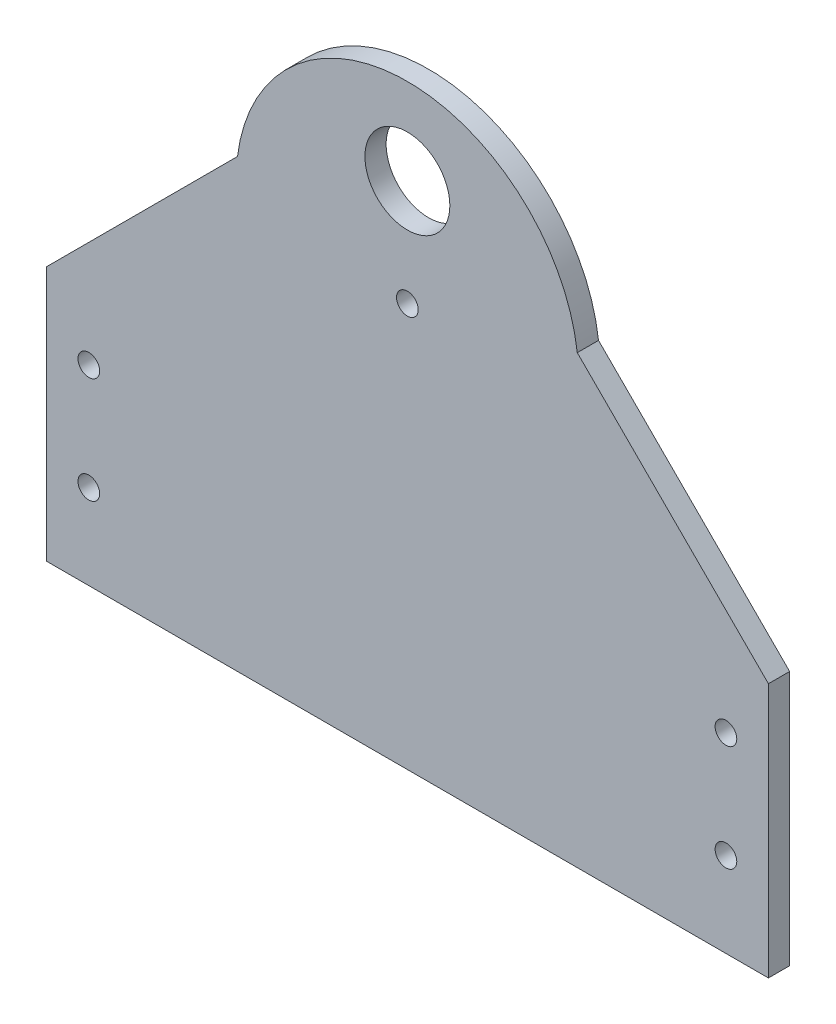
ISO-10303-21;
HEADER;
FILE_DESCRIPTION(('STEP AP214'),'2;1');
FILE_NAME('part.step','',(''),(''),'','','');
FILE_SCHEMA(('AUTOMOTIVE_DESIGN { 1 0 10303 214 1 1 1 1 }'));
ENDSEC;
DATA;
#1=APPLICATION_CONTEXT('core data for automotive mechanical design processes');
#2=APPLICATION_PROTOCOL_DEFINITION('international standard','automotive_design',2000,#1);
#3=PRODUCT_CONTEXT('',#1,'mechanical');
#4=PRODUCT('Part','Part','',(#3));
#5=PRODUCT_RELATED_PRODUCT_CATEGORY('part','',(#4));
#6=PRODUCT_DEFINITION_FORMATION('','',#4);
#7=PRODUCT_DEFINITION_CONTEXT('part definition',#1,'design');
#8=PRODUCT_DEFINITION('design','',#6,#7);
#9=PRODUCT_DEFINITION_SHAPE('','',#8);
#10=(LENGTH_UNIT() NAMED_UNIT(*) SI_UNIT(.MILLI.,.METRE.));
#11=(NAMED_UNIT(*) PLANE_ANGLE_UNIT() SI_UNIT($,.RADIAN.));
#12=(NAMED_UNIT(*) SI_UNIT($,.STERADIAN.) SOLID_ANGLE_UNIT());
#13=UNCERTAINTY_MEASURE_WITH_UNIT(LENGTH_MEASURE(1.E-05),#10,'distance_accuracy_value','');
#14=(GEOMETRIC_REPRESENTATION_CONTEXT(3) GLOBAL_UNCERTAINTY_ASSIGNED_CONTEXT((#13)) GLOBAL_UNIT_ASSIGNED_CONTEXT((#10,
#11,#12)) REPRESENTATION_CONTEXT('',''));
#15=CARTESIAN_POINT('',(0.,0.,0.));
#16=DIRECTION('',(0.,0.,1.));
#17=DIRECTION('',(1.,0.,0.));
#18=AXIS2_PLACEMENT_3D('',#15,#16,#17);
#19=CARTESIAN_POINT('',(0.,28.5999999999999,5.));
#20=DIRECTION('',(0.,0.,-1.));
#21=DIRECTION('',(-1.,0.,0.));
#22=AXIS2_PLACEMENT_3D('',#19,#20,#21);
#23=PLANE('',#22);
#24=DIRECTION('',(1.,0.,0.));
#25=VECTOR('',#24,1.);
#26=CARTESIAN_POINT('',(85.,-71.3999999999999,5.));
#27=LINE('',#26,#25);
#28=CARTESIAN_POINT('',(-85.,-71.3999999999999,5.));
#29=VERTEX_POINT('',#28);
#30=CARTESIAN_POINT('',(85.,-71.3999999999999,5.));
#31=VERTEX_POINT('',#30);
#32=EDGE_CURVE('E146',#29,#31,#27,.T.);
#33=ORIENTED_EDGE('',*,*,#32,.T.);
#34=DIRECTION('',(0.,1.,0.));
#35=VECTOR('',#34,1.);
#36=CARTESIAN_POINT('',(85.,-11.3999999999999,5.));
#37=LINE('',#36,#35);
#38=CARTESIAN_POINT('',(85.,-11.3999999999999,5.));
#39=VERTEX_POINT('',#38);
#40=EDGE_CURVE('E94',#31,#39,#37,.T.);
#41=ORIENTED_EDGE('',*,*,#40,.T.);
#42=DIRECTION('',(-0.707106781186549,0.707106781186546,0.));
#43=VECTOR('',#42,1.);
#44=CARTESIAN_POINT('',(40.,33.6,5.));
#45=LINE('',#44,#43);
#46=CARTESIAN_POINT('',(40.,33.6,5.));
#47=VERTEX_POINT('',#46);
#48=EDGE_CURVE('E107',#39,#47,#45,.T.);
#49=ORIENTED_EDGE('',*,*,#48,.T.);
#50=CARTESIAN_POINT('',(0.,28.5999999999999,5.));
#51=DIRECTION('',(0.,0.,1.));
#52=DIRECTION('',(-1.,0.,0.));
#53=AXIS2_PLACEMENT_3D('',#50,#51,#52);
#54=CIRCLE('',#53,40.3112887414928);
#55=CARTESIAN_POINT('',(-40.,33.6,5.));
#56=VERTEX_POINT('',#55);
#57=EDGE_CURVE('E101',#47,#56,#54,.T.);
#58=ORIENTED_EDGE('',*,*,#57,.T.);
#59=DIRECTION('',(-0.707106781186549,-0.707106781186546,0.));
#60=VECTOR('',#59,1.);
#61=CARTESIAN_POINT('',(-85.,-11.3999999999999,5.));
#62=LINE('',#61,#60);
#63=CARTESIAN_POINT('',(-85.,-11.3999999999999,5.));
#64=VERTEX_POINT('',#63);
#65=EDGE_CURVE('E105',#56,#64,#62,.T.);
#66=ORIENTED_EDGE('',*,*,#65,.T.);
#67=DIRECTION('',(0.,-1.,0.));
#68=VECTOR('',#67,1.);
#69=CARTESIAN_POINT('',(-85.,-71.3999999999999,5.));
#70=LINE('',#69,#68);
#71=EDGE_CURVE('E57',#64,#29,#70,.T.);
#72=ORIENTED_EDGE('',*,*,#71,.T.);
#73=EDGE_LOOP('',(#33,#41,#49,#58,#66,#72));
#74=FACE_BOUND('',#73,.T.);
#75=CARTESIAN_POINT('',(75.,-26.3999999999999,5.));
#76=DIRECTION('',(0.,0.,1.));
#77=DIRECTION('',(1.,0.,0.));
#78=AXIS2_PLACEMENT_3D('',#75,#76,#77);
#79=CIRCLE('',#78,2.54999999999999);
#80=CARTESIAN_POINT('',(77.55,-26.3999999999999,5.));
#81=VERTEX_POINT('',#80);
#82=EDGE_CURVE('E134',#81,#81,#79,.T.);
#83=ORIENTED_EDGE('',*,*,#82,.F.);
#84=EDGE_LOOP('',(#83));
#85=FACE_BOUND('',#84,.T.);
#86=CARTESIAN_POINT('',(75.,-51.3999999999999,5.));
#87=DIRECTION('',(0.,0.,1.));
#88=DIRECTION('',(1.,0.,0.));
#89=AXIS2_PLACEMENT_3D('',#86,#87,#88);
#90=CIRCLE('',#89,2.54999999999999);
#91=CARTESIAN_POINT('',(77.55,-51.3999999999999,5.));
#92=VERTEX_POINT('',#91);
#93=EDGE_CURVE('E242',#92,#92,#90,.T.);
#94=ORIENTED_EDGE('',*,*,#93,.F.);
#95=EDGE_LOOP('',(#94));
#96=FACE_BOUND('',#95,.T.);
#97=CARTESIAN_POINT('',(-75.,-26.3999999999999,5.));
#98=DIRECTION('',(0.,0.,1.));
#99=DIRECTION('',(1.,0.,0.));
#100=AXIS2_PLACEMENT_3D('',#97,#98,#99);
#101=CIRCLE('',#100,2.54999999999999);
#102=CARTESIAN_POINT('',(-72.45,-26.3999999999999,5.));
#103=VERTEX_POINT('',#102);
#104=EDGE_CURVE('E234',#103,#103,#101,.T.);
#105=ORIENTED_EDGE('',*,*,#104,.F.);
#106=EDGE_LOOP('',(#105));
#107=FACE_BOUND('',#106,.T.);
#108=CARTESIAN_POINT('',(-75.,-51.3999999999999,5.));
#109=DIRECTION('',(0.,0.,1.));
#110=DIRECTION('',(1.,0.,0.));
#111=AXIS2_PLACEMENT_3D('',#108,#109,#110);
#112=CIRCLE('',#111,2.54999999999999);
#113=CARTESIAN_POINT('',(-72.45,-51.3999999999999,5.));
#114=VERTEX_POINT('',#113);
#115=EDGE_CURVE('E226',#114,#114,#112,.T.);
#116=ORIENTED_EDGE('',*,*,#115,.F.);
#117=EDGE_LOOP('',(#116));
#118=FACE_BOUND('',#117,.T.);
#119=CARTESIAN_POINT('',(0.,23.6,5.));
#120=DIRECTION('',(0.,0.,1.));
#121=DIRECTION('',(1.,0.,0.));
#122=AXIS2_PLACEMENT_3D('',#119,#120,#121);
#123=CIRCLE('',#122,2.55);
#124=CARTESIAN_POINT('',(2.55000000000001,23.6,5.));
#125=VERTEX_POINT('',#124);
#126=EDGE_CURVE('E218',#125,#125,#123,.T.);
#127=ORIENTED_EDGE('',*,*,#126,.F.);
#128=EDGE_LOOP('',(#127));
#129=FACE_BOUND('',#128,.T.);
#130=CARTESIAN_POINT('',(0.,48.6,5.));
#131=DIRECTION('',(0.,0.,1.));
#132=DIRECTION('',(1.,0.,0.));
#133=AXIS2_PLACEMENT_3D('',#130,#131,#132);
#134=CIRCLE('',#133,10.);
#135=CARTESIAN_POINT('',(10.,48.6,5.));
#136=VERTEX_POINT('',#135);
#137=EDGE_CURVE('E207',#136,#136,#134,.T.);
#138=ORIENTED_EDGE('',*,*,#137,.F.);
#139=EDGE_LOOP('',(#138));
#140=FACE_BOUND('',#139,.T.);
#141=ADVANCED_FACE('F39',(#74,#85,#96,#107,#118,#129,#140),#23,.F.);
#142=CARTESIAN_POINT('',(0.,28.5999999999999,0.));
#143=DIRECTION('',(0.,0.,-1.));
#144=DIRECTION('',(-1.,0.,0.));
#145=AXIS2_PLACEMENT_3D('',#142,#143,#144);
#146=PLANE('',#145);
#147=CARTESIAN_POINT('',(0.,23.6,0.));
#148=DIRECTION('',(0.,0.,1.));
#149=DIRECTION('',(1.,0.,0.));
#150=AXIS2_PLACEMENT_3D('',#147,#148,#149);
#151=CIRCLE('',#150,2.55);
#152=CARTESIAN_POINT('',(2.55000000000001,23.6,0.));
#153=VERTEX_POINT('',#152);
#154=EDGE_CURVE('E215',#153,#153,#151,.T.);
#155=ORIENTED_EDGE('',*,*,#154,.T.);
#156=EDGE_LOOP('',(#155));
#157=FACE_BOUND('',#156,.T.);
#158=CARTESIAN_POINT('',(-75.,-26.3999999999999,0.));
#159=DIRECTION('',(0.,0.,1.));
#160=DIRECTION('',(1.,0.,0.));
#161=AXIS2_PLACEMENT_3D('',#158,#159,#160);
#162=CIRCLE('',#161,2.54999999999999);
#163=CARTESIAN_POINT('',(-72.45,-26.3999999999999,0.));
#164=VERTEX_POINT('',#163);
#165=EDGE_CURVE('E230',#164,#164,#162,.T.);
#166=ORIENTED_EDGE('',*,*,#165,.T.);
#167=EDGE_LOOP('',(#166));
#168=FACE_BOUND('',#167,.T.);
#169=CARTESIAN_POINT('',(75.,-26.3999999999999,0.));
#170=DIRECTION('',(0.,0.,1.));
#171=DIRECTION('',(1.,0.,0.));
#172=AXIS2_PLACEMENT_3D('',#169,#170,#171);
#173=CIRCLE('',#172,2.54999999999999);
#174=CARTESIAN_POINT('',(77.55,-26.3999999999999,0.));
#175=VERTEX_POINT('',#174);
#176=EDGE_CURVE('E246',#175,#175,#173,.T.);
#177=ORIENTED_EDGE('',*,*,#176,.T.);
#178=EDGE_LOOP('',(#177));
#179=FACE_BOUND('',#178,.T.);
#180=DIRECTION('',(1.,0.,0.));
#181=VECTOR('',#180,1.);
#182=CARTESIAN_POINT('',(85.,-71.3999999999999,0.));
#183=LINE('',#182,#181);
#184=CARTESIAN_POINT('',(-85.,-71.3999999999999,0.));
#185=VERTEX_POINT('',#184);
#186=CARTESIAN_POINT('',(85.,-71.3999999999999,0.));
#187=VERTEX_POINT('',#186);
#188=EDGE_CURVE('E129',#185,#187,#183,.T.);
#189=ORIENTED_EDGE('',*,*,#188,.F.);
#190=DIRECTION('',(0.,-1.,0.));
#191=VECTOR('',#190,1.);
#192=CARTESIAN_POINT('',(-85.,-71.3999999999999,0.));
#193=LINE('',#192,#191);
#194=CARTESIAN_POINT('',(-85.,-11.3999999999999,0.));
#195=VERTEX_POINT('',#194);
#196=EDGE_CURVE('E86',#195,#185,#193,.T.);
#197=ORIENTED_EDGE('',*,*,#196,.F.);
#198=DIRECTION('',(-0.707106781186549,-0.707106781186546,0.));
#199=VECTOR('',#198,1.);
#200=CARTESIAN_POINT('',(-85.,-11.3999999999999,0.));
#201=LINE('',#200,#199);
#202=CARTESIAN_POINT('',(-40.,33.6,0.));
#203=VERTEX_POINT('',#202);
#204=EDGE_CURVE('E80',#203,#195,#201,.T.);
#205=ORIENTED_EDGE('',*,*,#204,.F.);
#206=CARTESIAN_POINT('',(0.,28.5999999999999,0.));
#207=DIRECTION('',(0.,0.,1.));
#208=DIRECTION('',(-1.,0.,0.));
#209=AXIS2_PLACEMENT_3D('',#206,#207,#208);
#210=CIRCLE('',#209,40.3112887414928);
#211=CARTESIAN_POINT('',(40.,33.6,0.));
#212=VERTEX_POINT('',#211);
#213=EDGE_CURVE('E116',#212,#203,#210,.T.);
#214=ORIENTED_EDGE('',*,*,#213,.F.);
#215=DIRECTION('',(-0.707106781186549,0.707106781186546,0.));
#216=VECTOR('',#215,1.);
#217=CARTESIAN_POINT('',(40.,33.6,0.));
#218=LINE('',#217,#216);
#219=CARTESIAN_POINT('',(85.,-11.3999999999999,0.));
#220=VERTEX_POINT('',#219);
#221=EDGE_CURVE('E137',#220,#212,#218,.T.);
#222=ORIENTED_EDGE('',*,*,#221,.F.);
#223=DIRECTION('',(0.,1.,0.));
#224=VECTOR('',#223,1.);
#225=CARTESIAN_POINT('',(85.,-11.3999999999999,0.));
#226=LINE('',#225,#224);
#227=EDGE_CURVE('E133',#187,#220,#226,.T.);
#228=ORIENTED_EDGE('',*,*,#227,.F.);
#229=EDGE_LOOP('',(#189,#197,#205,#214,#222,#228));
#230=FACE_BOUND('',#229,.T.);
#231=CARTESIAN_POINT('',(75.,-51.3999999999999,0.));
#232=DIRECTION('',(0.,0.,1.));
#233=DIRECTION('',(1.,0.,0.));
#234=AXIS2_PLACEMENT_3D('',#231,#232,#233);
#235=CIRCLE('',#234,2.54999999999999);
#236=CARTESIAN_POINT('',(77.55,-51.3999999999999,0.));
#237=VERTEX_POINT('',#236);
#238=EDGE_CURVE('E238',#237,#237,#235,.T.);
#239=ORIENTED_EDGE('',*,*,#238,.T.);
#240=EDGE_LOOP('',(#239));
#241=FACE_BOUND('',#240,.T.);
#242=CARTESIAN_POINT('',(-75.,-51.3999999999999,0.));
#243=DIRECTION('',(0.,0.,1.));
#244=DIRECTION('',(1.,0.,0.));
#245=AXIS2_PLACEMENT_3D('',#242,#243,#244);
#246=CIRCLE('',#245,2.54999999999999);
#247=CARTESIAN_POINT('',(-72.45,-51.3999999999999,0.));
#248=VERTEX_POINT('',#247);
#249=EDGE_CURVE('E222',#248,#248,#246,.T.);
#250=ORIENTED_EDGE('',*,*,#249,.T.);
#251=EDGE_LOOP('',(#250));
#252=FACE_BOUND('',#251,.T.);
#253=CARTESIAN_POINT('',(0.,48.6,0.));
#254=DIRECTION('',(0.,0.,1.));
#255=DIRECTION('',(1.,0.,0.));
#256=AXIS2_PLACEMENT_3D('',#253,#254,#255);
#257=CIRCLE('',#256,10.);
#258=CARTESIAN_POINT('',(10.,48.6,0.));
#259=VERTEX_POINT('',#258);
#260=EDGE_CURVE('E210',#259,#259,#257,.T.);
#261=ORIENTED_EDGE('',*,*,#260,.T.);
#262=EDGE_LOOP('',(#261));
#263=FACE_BOUND('',#262,.T.);
#264=ADVANCED_FACE('F159',(#157,#168,#179,#230,#241,#252,#263),#146,.T.);
#265=CARTESIAN_POINT('',(85.,-71.3999999999999,5.));
#266=DIRECTION('',(0.,1.,0.));
#267=DIRECTION('',(0.,0.,1.));
#268=AXIS2_PLACEMENT_3D('',#265,#266,#267);
#269=PLANE('',#268);
#270=ORIENTED_EDGE('',*,*,#188,.T.);
#271=DIRECTION('',(0.,0.,-1.));
#272=VECTOR('',#271,1.);
#273=CARTESIAN_POINT('',(85.,-71.3999999999999,5.));
#274=LINE('',#273,#272);
#275=EDGE_CURVE('E11',#31,#187,#274,.T.);
#276=ORIENTED_EDGE('',*,*,#275,.F.);
#277=ORIENTED_EDGE('',*,*,#32,.F.);
#278=DIRECTION('',(0.,0.,-1.));
#279=VECTOR('',#278,1.);
#280=CARTESIAN_POINT('',(-85.,-71.3999999999999,5.));
#281=LINE('',#280,#279);
#282=EDGE_CURVE('E125',#29,#185,#281,.T.);
#283=ORIENTED_EDGE('',*,*,#282,.T.);
#284=EDGE_LOOP('',(#270,#276,#277,#283));
#285=FACE_BOUND('',#284,.T.);
#286=ADVANCED_FACE('F41',(#285),#269,.F.);
#287=CARTESIAN_POINT('',(85.,-11.3999999999999,5.));
#288=DIRECTION('',(-1.,0.,0.));
#289=DIRECTION('',(0.,0.,1.));
#290=AXIS2_PLACEMENT_3D('',#287,#288,#289);
#291=PLANE('',#290);
#292=ORIENTED_EDGE('',*,*,#227,.T.);
#293=DIRECTION('',(0.,0.,-1.));
#294=VECTOR('',#293,1.);
#295=CARTESIAN_POINT('',(85.,-11.3999999999999,5.));
#296=LINE('',#295,#294);
#297=EDGE_CURVE('E49',#39,#220,#296,.T.);
#298=ORIENTED_EDGE('',*,*,#297,.F.);
#299=ORIENTED_EDGE('',*,*,#40,.F.);
#300=ORIENTED_EDGE('',*,*,#275,.T.);
#301=EDGE_LOOP('',(#292,#298,#299,#300));
#302=FACE_BOUND('',#301,.T.);
#303=ADVANCED_FACE('F330',(#302),#291,.F.);
#304=CARTESIAN_POINT('',(40.,33.6,5.));
#305=DIRECTION('',(-0.707106781186546,-0.707106781186549,0.));
#306=DIRECTION('',(0.707106781186549,-0.707106781186546,0.));
#307=AXIS2_PLACEMENT_3D('',#304,#305,#306);
#308=PLANE('',#307);
#309=ORIENTED_EDGE('',*,*,#221,.T.);
#310=DIRECTION('',(0.,0.,-1.));
#311=VECTOR('',#310,1.);
#312=CARTESIAN_POINT('',(40.,33.6,5.));
#313=LINE('',#312,#311);
#314=EDGE_CURVE('E118',#47,#212,#313,.T.);
#315=ORIENTED_EDGE('',*,*,#314,.F.);
#316=ORIENTED_EDGE('',*,*,#48,.F.);
#317=ORIENTED_EDGE('',*,*,#297,.T.);
#318=EDGE_LOOP('',(#309,#315,#316,#317));
#319=FACE_BOUND('',#318,.T.);
#320=ADVANCED_FACE('F156',(#319),#308,.F.);
#321=CARTESIAN_POINT('',(0.,28.5999999999999,5.));
#322=DIRECTION('',(0.,0.,-1.));
#323=DIRECTION('',(-1.,0.,0.));
#324=AXIS2_PLACEMENT_3D('',#321,#322,#323);
#325=CYLINDRICAL_SURFACE('',#324,40.3112887414928);
#326=ORIENTED_EDGE('',*,*,#213,.T.);
#327=DIRECTION('',(0.,0.,-1.));
#328=VECTOR('',#327,1.);
#329=CARTESIAN_POINT('',(-40.,33.6,5.));
#330=LINE('',#329,#328);
#331=EDGE_CURVE('E113',#56,#203,#330,.T.);
#332=ORIENTED_EDGE('',*,*,#331,.F.);
#333=ORIENTED_EDGE('',*,*,#57,.F.);
#334=ORIENTED_EDGE('',*,*,#314,.T.);
#335=EDGE_LOOP('',(#326,#332,#333,#334));
#336=FACE_BOUND('',#335,.T.);
#337=ADVANCED_FACE('F114',(#336),#325,.T.);
#338=CARTESIAN_POINT('',(-85.,-11.3999999999999,5.));
#339=DIRECTION('',(0.707106781186546,-0.707106781186549,0.));
#340=DIRECTION('',(0.707106781186549,0.707106781186546,0.));
#341=AXIS2_PLACEMENT_3D('',#338,#339,#340);
#342=PLANE('',#341);
#343=ORIENTED_EDGE('',*,*,#204,.T.);
#344=DIRECTION('',(0.,0.,-1.));
#345=VECTOR('',#344,1.);
#346=CARTESIAN_POINT('',(-85.,-11.3999999999999,5.));
#347=LINE('',#346,#345);
#348=EDGE_CURVE('E119',#64,#195,#347,.T.);
#349=ORIENTED_EDGE('',*,*,#348,.F.);
#350=ORIENTED_EDGE('',*,*,#65,.F.);
#351=ORIENTED_EDGE('',*,*,#331,.T.);
#352=EDGE_LOOP('',(#343,#349,#350,#351));
#353=FACE_BOUND('',#352,.T.);
#354=ADVANCED_FACE('F121',(#353),#342,.F.);
#355=CARTESIAN_POINT('',(-85.,-71.3999999999999,5.));
#356=DIRECTION('',(1.,0.,0.));
#357=DIRECTION('',(0.,0.,-1.));
#358=AXIS2_PLACEMENT_3D('',#355,#356,#357);
#359=PLANE('',#358);
#360=ORIENTED_EDGE('',*,*,#196,.T.);
#361=ORIENTED_EDGE('',*,*,#282,.F.);
#362=ORIENTED_EDGE('',*,*,#71,.F.);
#363=ORIENTED_EDGE('',*,*,#348,.T.);
#364=EDGE_LOOP('',(#360,#361,#362,#363));
#365=FACE_BOUND('',#364,.T.);
#366=ADVANCED_FACE('F164',(#365),#359,.F.);
#367=CARTESIAN_POINT('',(75.,-26.3999999999999,5.));
#368=DIRECTION('',(0.,0.,-1.));
#369=DIRECTION('',(-1.,0.,0.));
#370=AXIS2_PLACEMENT_3D('',#367,#368,#369);
#371=CYLINDRICAL_SURFACE('',#370,2.54999999999999);
#372=ORIENTED_EDGE('',*,*,#82,.T.);
#373=EDGE_LOOP('',(#372));
#374=FACE_BOUND('',#373,.T.);
#375=ORIENTED_EDGE('',*,*,#176,.F.);
#376=EDGE_LOOP('',(#375));
#377=FACE_BOUND('',#376,.T.);
#378=ADVANCED_FACE('F166',(#374,#377),#371,.F.);
#379=CARTESIAN_POINT('',(75.,-51.3999999999999,5.));
#380=DIRECTION('',(0.,0.,-1.));
#381=DIRECTION('',(-1.,0.,0.));
#382=AXIS2_PLACEMENT_3D('',#379,#380,#381);
#383=CYLINDRICAL_SURFACE('',#382,2.54999999999999);
#384=ORIENTED_EDGE('',*,*,#93,.T.);
#385=EDGE_LOOP('',(#384));
#386=FACE_BOUND('',#385,.T.);
#387=ORIENTED_EDGE('',*,*,#238,.F.);
#388=EDGE_LOOP('',(#387));
#389=FACE_BOUND('',#388,.T.);
#390=ADVANCED_FACE('F172',(#386,#389),#383,.F.);
#391=CARTESIAN_POINT('',(-75.,-26.3999999999999,5.));
#392=DIRECTION('',(0.,0.,-1.));
#393=DIRECTION('',(-1.,0.,0.));
#394=AXIS2_PLACEMENT_3D('',#391,#392,#393);
#395=CYLINDRICAL_SURFACE('',#394,2.54999999999999);
#396=ORIENTED_EDGE('',*,*,#104,.T.);
#397=EDGE_LOOP('',(#396));
#398=FACE_BOUND('',#397,.T.);
#399=ORIENTED_EDGE('',*,*,#165,.F.);
#400=EDGE_LOOP('',(#399));
#401=FACE_BOUND('',#400,.T.);
#402=ADVANCED_FACE('F186',(#398,#401),#395,.F.);
#403=CARTESIAN_POINT('',(-75.,-51.3999999999999,5.));
#404=DIRECTION('',(0.,0.,-1.));
#405=DIRECTION('',(-1.,0.,0.));
#406=AXIS2_PLACEMENT_3D('',#403,#404,#405);
#407=CYLINDRICAL_SURFACE('',#406,2.54999999999999);
#408=ORIENTED_EDGE('',*,*,#115,.T.);
#409=EDGE_LOOP('',(#408));
#410=FACE_BOUND('',#409,.T.);
#411=ORIENTED_EDGE('',*,*,#249,.F.);
#412=EDGE_LOOP('',(#411));
#413=FACE_BOUND('',#412,.T.);
#414=ADVANCED_FACE('F190',(#410,#413),#407,.F.);
#415=CARTESIAN_POINT('',(0.,23.6,5.));
#416=DIRECTION('',(0.,0.,-1.));
#417=DIRECTION('',(-1.,0.,0.));
#418=AXIS2_PLACEMENT_3D('',#415,#416,#417);
#419=CYLINDRICAL_SURFACE('',#418,2.55);
#420=ORIENTED_EDGE('',*,*,#126,.T.);
#421=EDGE_LOOP('',(#420));
#422=FACE_BOUND('',#421,.T.);
#423=ORIENTED_EDGE('',*,*,#154,.F.);
#424=EDGE_LOOP('',(#423));
#425=FACE_BOUND('',#424,.T.);
#426=ADVANCED_FACE('F194',(#422,#425),#419,.F.);
#427=CARTESIAN_POINT('',(0.,48.6,5.));
#428=DIRECTION('',(0.,0.,-1.));
#429=DIRECTION('',(-1.,0.,0.));
#430=AXIS2_PLACEMENT_3D('',#427,#428,#429);
#431=CYLINDRICAL_SURFACE('',#430,10.);
#432=ORIENTED_EDGE('',*,*,#137,.T.);
#433=EDGE_LOOP('',(#432));
#434=FACE_BOUND('',#433,.T.);
#435=ORIENTED_EDGE('',*,*,#260,.F.);
#436=EDGE_LOOP('',(#435));
#437=FACE_BOUND('',#436,.T.);
#438=ADVANCED_FACE('F198',(#434,#437),#431,.F.);
#439=CLOSED_SHELL('',(#141,#264,#286,#303,#320,#337,#354,#366,#378,#390,#402,#414,#426,#438));
#440=MANIFOLD_SOLID_BREP('B2',#439);
#441=ADVANCED_BREP_SHAPE_REPRESENTATION('',(#18,#440),#14);
#442=SHAPE_DEFINITION_REPRESENTATION(#9,#441);
ENDSEC;
END-ISO-10303-21;
